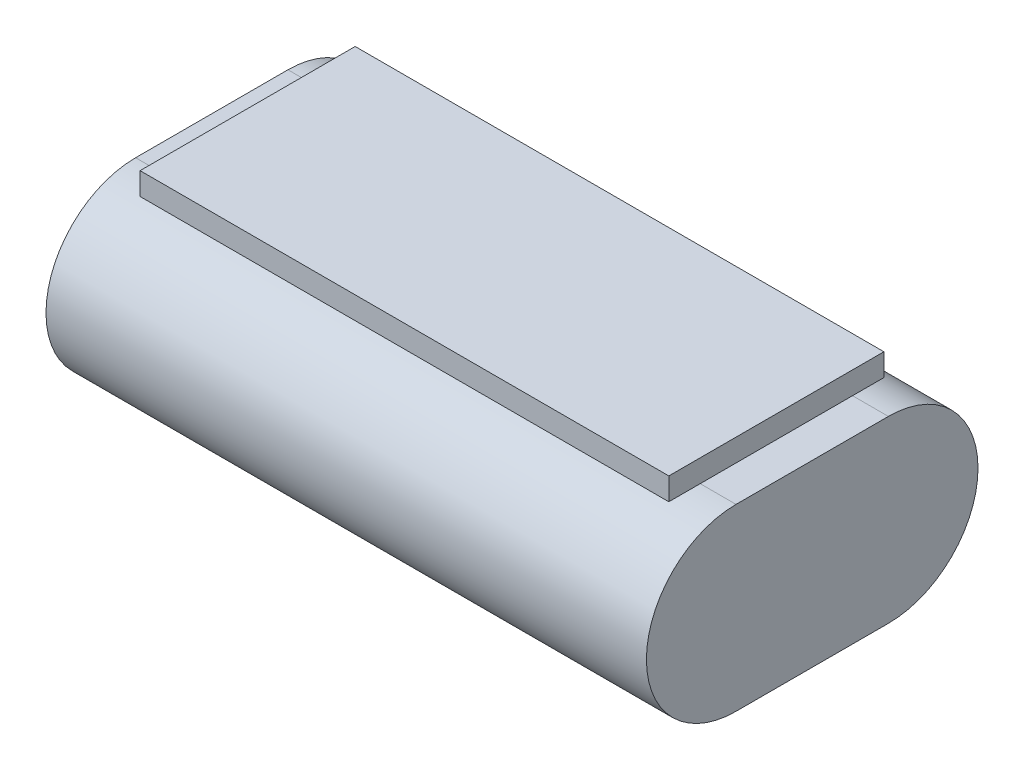
ISO-10303-21;
HEADER;
FILE_DESCRIPTION(('STEP AP214'),'2;1');
FILE_NAME('part.step','',(''),(''),'','','');
FILE_SCHEMA(('AUTOMOTIVE_DESIGN { 1 0 10303 214 1 1 1 1 }'));
ENDSEC;
DATA;
#1=APPLICATION_CONTEXT('core data for automotive mechanical design processes');
#2=APPLICATION_PROTOCOL_DEFINITION('international standard','automotive_design',2000,#1);
#3=PRODUCT_CONTEXT('',#1,'mechanical');
#4=PRODUCT('Part','Part','',(#3));
#5=PRODUCT_RELATED_PRODUCT_CATEGORY('part','',(#4));
#6=PRODUCT_DEFINITION_FORMATION('','',#4);
#7=PRODUCT_DEFINITION_CONTEXT('part definition',#1,'design');
#8=PRODUCT_DEFINITION('design','',#6,#7);
#9=PRODUCT_DEFINITION_SHAPE('','',#8);
#10=(LENGTH_UNIT() NAMED_UNIT(*) SI_UNIT(.MILLI.,.METRE.));
#11=(NAMED_UNIT(*) PLANE_ANGLE_UNIT() SI_UNIT($,.RADIAN.));
#12=(NAMED_UNIT(*) SI_UNIT($,.STERADIAN.) SOLID_ANGLE_UNIT());
#13=UNCERTAINTY_MEASURE_WITH_UNIT(LENGTH_MEASURE(1.E-05),#10,'distance_accuracy_value','');
#14=(GEOMETRIC_REPRESENTATION_CONTEXT(3) GLOBAL_UNCERTAINTY_ASSIGNED_CONTEXT((#13)) GLOBAL_UNIT_ASSIGNED_CONTEXT((#10,
#11,#12)) REPRESENTATION_CONTEXT('',''));
#15=CARTESIAN_POINT('',(0.,0.,0.));
#16=DIRECTION('',(0.,0.,1.));
#17=DIRECTION('',(1.,0.,0.));
#18=AXIS2_PLACEMENT_3D('',#15,#16,#17);
#19=CARTESIAN_POINT('',(33.5,10.,8.5));
#20=DIRECTION('',(0.,-1.,0.));
#21=DIRECTION('',(0.,0.,-1.));
#22=AXIS2_PLACEMENT_3D('',#19,#20,#21);
#23=PLANE('',#22);
#24=DIRECTION('',(0.,0.,-1.));
#25=VECTOR('',#24,1.);
#26=CARTESIAN_POINT('',(29.5,10.,8.5));
#27=LINE('',#26,#25);
#28=CARTESIAN_POINT('',(29.5,10.,8.5));
#29=VERTEX_POINT('',#28);
#30=CARTESIAN_POINT('',(29.5,10.,-8.5));
#31=VERTEX_POINT('',#30);
#32=EDGE_CURVE('E11',#29,#31,#27,.T.);
#33=ORIENTED_EDGE('',*,*,#32,.F.);
#34=DIRECTION('',(-1.,0.,0.));
#35=VECTOR('',#34,1.);
#36=CARTESIAN_POINT('',(33.5,10.,8.5));
#37=LINE('',#36,#35);
#38=CARTESIAN_POINT('',(33.5,10.,8.5));
#39=VERTEX_POINT('',#38);
#40=EDGE_CURVE('E165',#39,#29,#37,.T.);
#41=ORIENTED_EDGE('',*,*,#40,.F.);
#42=DIRECTION('',(0.,0.,1.));
#43=VECTOR('',#42,1.);
#44=CARTESIAN_POINT('',(33.5,10.,8.5));
#45=LINE('',#44,#43);
#46=CARTESIAN_POINT('',(33.5,10.,-8.5));
#47=VERTEX_POINT('',#46);
#48=EDGE_CURVE('E156',#47,#39,#45,.T.);
#49=ORIENTED_EDGE('',*,*,#48,.F.);
#50=DIRECTION('',(-1.,0.,0.));
#51=VECTOR('',#50,1.);
#52=CARTESIAN_POINT('',(33.5,10.,-8.5));
#53=LINE('',#52,#51);
#54=EDGE_CURVE('E170',#47,#31,#53,.T.);
#55=ORIENTED_EDGE('',*,*,#54,.T.);
#56=EDGE_LOOP('',(#33,#41,#49,#55));
#57=FACE_BOUND('',#56,.T.);
#58=ADVANCED_FACE('F35',(#57),#23,.F.);
#59=DIRECTION('',(0.,0.,1.));
#60=VECTOR('',#59,1.);
#61=CARTESIAN_POINT('',(-29.5,10.,8.5));
#62=LINE('',#61,#60);
#63=CARTESIAN_POINT('',(-29.5,10.,-8.5));
#64=VERTEX_POINT('',#63);
#65=CARTESIAN_POINT('',(-29.5,10.,8.5));
#66=VERTEX_POINT('',#65);
#67=EDGE_CURVE('E43',#64,#66,#62,.T.);
#68=ORIENTED_EDGE('',*,*,#67,.F.);
#69=CARTESIAN_POINT('',(-33.5,10.,-8.5));
#70=VERTEX_POINT('',#69);
#71=EDGE_CURVE('E168',#64,#70,#53,.T.);
#72=ORIENTED_EDGE('',*,*,#71,.T.);
#73=DIRECTION('',(0.,0.,1.));
#74=VECTOR('',#73,1.);
#75=CARTESIAN_POINT('',(-33.5,10.,8.5));
#76=LINE('',#75,#74);
#77=CARTESIAN_POINT('',(-33.5,10.,8.5));
#78=VERTEX_POINT('',#77);
#79=EDGE_CURVE('E152',#70,#78,#76,.T.);
#80=ORIENTED_EDGE('',*,*,#79,.T.);
#81=EDGE_CURVE('E157',#66,#78,#37,.T.);
#82=ORIENTED_EDGE('',*,*,#81,.F.);
#83=EDGE_LOOP('',(#68,#72,#80,#82));
#84=FACE_BOUND('',#83,.T.);
#85=ADVANCED_FACE('F230',(#84),#23,.F.);
#86=CARTESIAN_POINT('',(33.5,0.,8.5));
#87=DIRECTION('',(-1.,0.,0.));
#88=DIRECTION('',(0.,0.,1.));
#89=AXIS2_PLACEMENT_3D('',#86,#87,#88);
#90=CYLINDRICAL_SURFACE('',#89,10.);
#91=CARTESIAN_POINT('',(-33.5,0.,8.5));
#92=DIRECTION('',(1.,0.,0.));
#93=DIRECTION('',(0.,0.,-1.));
#94=AXIS2_PLACEMENT_3D('',#91,#92,#93);
#95=CIRCLE('',#94,10.);
#96=CARTESIAN_POINT('',(-33.5,-10.,8.5));
#97=VERTEX_POINT('',#96);
#98=EDGE_CURVE('E139',#78,#97,#95,.T.);
#99=ORIENTED_EDGE('',*,*,#98,.T.);
#100=DIRECTION('',(-1.,0.,0.));
#101=VECTOR('',#100,1.);
#102=CARTESIAN_POINT('',(33.5,-10.,8.5));
#103=LINE('',#102,#101);
#104=CARTESIAN_POINT('',(33.5,-10.,8.5));
#105=VERTEX_POINT('',#104);
#106=EDGE_CURVE('E175',#105,#97,#103,.T.);
#107=ORIENTED_EDGE('',*,*,#106,.F.);
#108=CARTESIAN_POINT('',(33.5,0.,8.5));
#109=DIRECTION('',(1.,0.,0.));
#110=DIRECTION('',(0.,0.,-1.));
#111=AXIS2_PLACEMENT_3D('',#108,#109,#110);
#112=CIRCLE('',#111,10.);
#113=EDGE_CURVE('E148',#39,#105,#112,.T.);
#114=ORIENTED_EDGE('',*,*,#113,.F.);
#115=ORIENTED_EDGE('',*,*,#40,.T.);
#116=EDGE_CURVE('E169',#29,#66,#37,.T.);
#117=ORIENTED_EDGE('',*,*,#116,.T.);
#118=ORIENTED_EDGE('',*,*,#81,.T.);
#119=EDGE_LOOP('',(#99,#107,#114,#115,#117,#118));
#120=FACE_BOUND('',#119,.T.);
#121=ADVANCED_FACE('F37',(#120),#90,.T.);
#122=CARTESIAN_POINT('',(33.5,-10.,8.5));
#123=DIRECTION('',(0.,1.,0.));
#124=DIRECTION('',(0.,0.,1.));
#125=AXIS2_PLACEMENT_3D('',#122,#123,#124);
#126=PLANE('',#125);
#127=DIRECTION('',(0.,0.,-1.));
#128=VECTOR('',#127,1.);
#129=CARTESIAN_POINT('',(-33.5,-10.,8.5));
#130=LINE('',#129,#128);
#131=CARTESIAN_POINT('',(-33.5,-10.,-8.49999999999999));
#132=VERTEX_POINT('',#131);
#133=EDGE_CURVE('E142',#97,#132,#130,.T.);
#134=ORIENTED_EDGE('',*,*,#133,.T.);
#135=DIRECTION('',(-1.,0.,0.));
#136=VECTOR('',#135,1.);
#137=CARTESIAN_POINT('',(33.5,-10.,-8.49999999999999));
#138=LINE('',#137,#136);
#139=CARTESIAN_POINT('',(33.5,-10.,-8.49999999999999));
#140=VERTEX_POINT('',#139);
#141=EDGE_CURVE('E172',#140,#132,#138,.T.);
#142=ORIENTED_EDGE('',*,*,#141,.F.);
#143=DIRECTION('',(0.,0.,-1.));
#144=VECTOR('',#143,1.);
#145=CARTESIAN_POINT('',(33.5,-10.,8.5));
#146=LINE('',#145,#144);
#147=EDGE_CURVE('E151',#105,#140,#146,.T.);
#148=ORIENTED_EDGE('',*,*,#147,.F.);
#149=ORIENTED_EDGE('',*,*,#106,.T.);
#150=EDGE_LOOP('',(#134,#142,#148,#149));
#151=FACE_BOUND('',#150,.T.);
#152=ADVANCED_FACE('F219',(#151),#126,.F.);
#153=CARTESIAN_POINT('',(33.5,0.,-8.5));
#154=DIRECTION('',(-1.,0.,0.));
#155=DIRECTION('',(0.,0.,1.));
#156=AXIS2_PLACEMENT_3D('',#153,#154,#155);
#157=CYLINDRICAL_SURFACE('',#156,10.);
#158=CARTESIAN_POINT('',(-33.5,0.,-8.5));
#159=DIRECTION('',(1.,0.,0.));
#160=DIRECTION('',(0.,0.,-1.));
#161=AXIS2_PLACEMENT_3D('',#158,#159,#160);
#162=CIRCLE('',#161,10.);
#163=EDGE_CURVE('E160',#132,#70,#162,.T.);
#164=ORIENTED_EDGE('',*,*,#163,.T.);
#165=ORIENTED_EDGE('',*,*,#71,.F.);
#166=EDGE_CURVE('E56',#31,#64,#53,.T.);
#167=ORIENTED_EDGE('',*,*,#166,.F.);
#168=ORIENTED_EDGE('',*,*,#54,.F.);
#169=CARTESIAN_POINT('',(33.5,0.,-8.5));
#170=DIRECTION('',(1.,0.,0.));
#171=DIRECTION('',(0.,0.,-1.));
#172=AXIS2_PLACEMENT_3D('',#169,#170,#171);
#173=CIRCLE('',#172,10.);
#174=EDGE_CURVE('E154',#140,#47,#173,.T.);
#175=ORIENTED_EDGE('',*,*,#174,.F.);
#176=ORIENTED_EDGE('',*,*,#141,.T.);
#177=EDGE_LOOP('',(#164,#165,#167,#168,#175,#176));
#178=FACE_BOUND('',#177,.T.);
#179=ADVANCED_FACE('F215',(#178),#157,.T.);
#180=CARTESIAN_POINT('',(33.5,0.,8.5));
#181=DIRECTION('',(1.,0.,0.));
#182=DIRECTION('',(0.,0.,-1.));
#183=AXIS2_PLACEMENT_3D('',#180,#181,#182);
#184=PLANE('',#183);
#185=ORIENTED_EDGE('',*,*,#113,.T.);
#186=ORIENTED_EDGE('',*,*,#147,.T.);
#187=ORIENTED_EDGE('',*,*,#174,.T.);
#188=ORIENTED_EDGE('',*,*,#48,.T.);
#189=EDGE_LOOP('',(#185,#186,#187,#188));
#190=FACE_BOUND('',#189,.T.);
#191=ADVANCED_FACE('F212',(#190),#184,.T.);
#192=CARTESIAN_POINT('',(-33.5,0.,8.5));
#193=DIRECTION('',(1.,0.,0.));
#194=DIRECTION('',(0.,0.,-1.));
#195=AXIS2_PLACEMENT_3D('',#192,#193,#194);
#196=PLANE('',#195);
#197=ORIENTED_EDGE('',*,*,#98,.F.);
#198=ORIENTED_EDGE('',*,*,#79,.F.);
#199=ORIENTED_EDGE('',*,*,#163,.F.);
#200=ORIENTED_EDGE('',*,*,#133,.F.);
#201=EDGE_LOOP('',(#197,#198,#199,#200));
#202=FACE_BOUND('',#201,.T.);
#203=ADVANCED_FACE('F225',(#202),#196,.F.);
#204=CARTESIAN_POINT('',(0.,10.,0.));
#205=DIRECTION('',(0.,-1.,0.));
#206=DIRECTION('',(0.,0.,-1.));
#207=AXIS2_PLACEMENT_3D('',#204,#205,#206);
#208=PLANE('',#207);
#209=ORIENTED_EDGE('',*,*,#116,.F.);
#210=DIRECTION('',(0.,0.,-1.));
#211=VECTOR('',#210,1.);
#212=CARTESIAN_POINT('',(29.5,10.,12.));
#213=LINE('',#212,#211);
#214=CARTESIAN_POINT('',(29.5,10.,12.));
#215=VERTEX_POINT('',#214);
#216=EDGE_CURVE('E201',#215,#29,#213,.T.);
#217=ORIENTED_EDGE('',*,*,#216,.F.);
#218=DIRECTION('',(1.,0.,0.));
#219=VECTOR('',#218,1.);
#220=CARTESIAN_POINT('',(-29.5,10.,12.));
#221=LINE('',#220,#219);
#222=CARTESIAN_POINT('',(-29.5,10.,12.));
#223=VERTEX_POINT('',#222);
#224=EDGE_CURVE('E132',#223,#215,#221,.T.);
#225=ORIENTED_EDGE('',*,*,#224,.F.);
#226=DIRECTION('',(0.,0.,1.));
#227=VECTOR('',#226,1.);
#228=CARTESIAN_POINT('',(-29.5,10.,12.));
#229=LINE('',#228,#227);
#230=EDGE_CURVE('E182',#66,#223,#229,.T.);
#231=ORIENTED_EDGE('',*,*,#230,.F.);
#232=EDGE_LOOP('',(#209,#217,#225,#231));
#233=FACE_BOUND('',#232,.T.);
#234=ADVANCED_FACE('F200',(#233),#208,.T.);
#235=CARTESIAN_POINT('',(29.5,12.5,12.));
#236=DIRECTION('',(-1.,0.,0.));
#237=DIRECTION('',(0.,0.,1.));
#238=AXIS2_PLACEMENT_3D('',#235,#236,#237);
#239=PLANE('',#238);
#240=ORIENTED_EDGE('',*,*,#216,.T.);
#241=ORIENTED_EDGE('',*,*,#32,.T.);
#242=CARTESIAN_POINT('',(29.5,10.,-12.));
#243=VERTEX_POINT('',#242);
#244=EDGE_CURVE('E137',#31,#243,#213,.T.);
#245=ORIENTED_EDGE('',*,*,#244,.T.);
#246=DIRECTION('',(0.,-1.,0.));
#247=VECTOR('',#246,1.);
#248=CARTESIAN_POINT('',(29.5,12.5,-12.));
#249=LINE('',#248,#247);
#250=CARTESIAN_POINT('',(29.5,12.5,-12.));
#251=VERTEX_POINT('',#250);
#252=EDGE_CURVE('E117',#251,#243,#249,.T.);
#253=ORIENTED_EDGE('',*,*,#252,.F.);
#254=DIRECTION('',(0.,0.,-1.));
#255=VECTOR('',#254,1.);
#256=CARTESIAN_POINT('',(29.5,12.5,12.));
#257=LINE('',#256,#255);
#258=CARTESIAN_POINT('',(29.5,12.5,12.));
#259=VERTEX_POINT('',#258);
#260=EDGE_CURVE('E123',#259,#251,#257,.T.);
#261=ORIENTED_EDGE('',*,*,#260,.F.);
#262=DIRECTION('',(0.,-1.,0.));
#263=VECTOR('',#262,1.);
#264=CARTESIAN_POINT('',(29.5,12.5,12.));
#265=LINE('',#264,#263);
#266=EDGE_CURVE('E193',#259,#215,#265,.T.);
#267=ORIENTED_EDGE('',*,*,#266,.T.);
#268=EDGE_LOOP('',(#240,#241,#245,#253,#261,#267));
#269=FACE_BOUND('',#268,.T.);
#270=ADVANCED_FACE('F135',(#269),#239,.F.);
#271=CARTESIAN_POINT('',(-29.5,12.5,-12.));
#272=DIRECTION('',(0.,0.,1.));
#273=DIRECTION('',(1.,0.,0.));
#274=AXIS2_PLACEMENT_3D('',#271,#272,#273);
#275=PLANE('',#274);
#276=DIRECTION('',(-1.,0.,0.));
#277=VECTOR('',#276,1.);
#278=CARTESIAN_POINT('',(-29.5,10.,-12.));
#279=LINE('',#278,#277);
#280=CARTESIAN_POINT('',(-29.5,10.,-12.));
#281=VERTEX_POINT('',#280);
#282=EDGE_CURVE('E189',#243,#281,#279,.T.);
#283=ORIENTED_EDGE('',*,*,#282,.T.);
#284=DIRECTION('',(0.,-1.,0.));
#285=VECTOR('',#284,1.);
#286=CARTESIAN_POINT('',(-29.5,12.5,-12.));
#287=LINE('',#286,#285);
#288=CARTESIAN_POINT('',(-29.5,12.5,-12.));
#289=VERTEX_POINT('',#288);
#290=EDGE_CURVE('E119',#289,#281,#287,.T.);
#291=ORIENTED_EDGE('',*,*,#290,.F.);
#292=DIRECTION('',(-1.,0.,0.));
#293=VECTOR('',#292,1.);
#294=CARTESIAN_POINT('',(-29.5,12.5,-12.));
#295=LINE('',#294,#293);
#296=EDGE_CURVE('E113',#251,#289,#295,.T.);
#297=ORIENTED_EDGE('',*,*,#296,.F.);
#298=ORIENTED_EDGE('',*,*,#252,.T.);
#299=EDGE_LOOP('',(#283,#291,#297,#298));
#300=FACE_BOUND('',#299,.T.);
#301=ADVANCED_FACE('F115',(#300),#275,.F.);
#302=CARTESIAN_POINT('',(-29.5,12.5,12.));
#303=DIRECTION('',(1.,0.,0.));
#304=DIRECTION('',(0.,0.,-1.));
#305=AXIS2_PLACEMENT_3D('',#302,#303,#304);
#306=PLANE('',#305);
#307=EDGE_CURVE('E185',#281,#64,#229,.T.);
#308=ORIENTED_EDGE('',*,*,#307,.T.);
#309=ORIENTED_EDGE('',*,*,#67,.T.);
#310=ORIENTED_EDGE('',*,*,#230,.T.);
#311=DIRECTION('',(0.,-1.,0.));
#312=VECTOR('',#311,1.);
#313=CARTESIAN_POINT('',(-29.5,12.5,12.));
#314=LINE('',#313,#312);
#315=CARTESIAN_POINT('',(-29.5,12.5,12.));
#316=VERTEX_POINT('',#315);
#317=EDGE_CURVE('E144',#316,#223,#314,.T.);
#318=ORIENTED_EDGE('',*,*,#317,.F.);
#319=DIRECTION('',(0.,0.,1.));
#320=VECTOR('',#319,1.);
#321=CARTESIAN_POINT('',(-29.5,12.5,12.));
#322=LINE('',#321,#320);
#323=EDGE_CURVE('E122',#289,#316,#322,.T.);
#324=ORIENTED_EDGE('',*,*,#323,.F.);
#325=ORIENTED_EDGE('',*,*,#290,.T.);
#326=EDGE_LOOP('',(#308,#309,#310,#318,#324,#325));
#327=FACE_BOUND('',#326,.T.);
#328=ADVANCED_FACE('F179',(#327),#306,.F.);
#329=CARTESIAN_POINT('',(-29.5,12.5,12.));
#330=DIRECTION('',(0.,0.,-1.));
#331=DIRECTION('',(-1.,0.,0.));
#332=AXIS2_PLACEMENT_3D('',#329,#330,#331);
#333=PLANE('',#332);
#334=ORIENTED_EDGE('',*,*,#224,.T.);
#335=ORIENTED_EDGE('',*,*,#266,.F.);
#336=DIRECTION('',(1.,0.,0.));
#337=VECTOR('',#336,1.);
#338=CARTESIAN_POINT('',(-29.5,12.5,12.));
#339=LINE('',#338,#337);
#340=EDGE_CURVE('E128',#316,#259,#339,.T.);
#341=ORIENTED_EDGE('',*,*,#340,.F.);
#342=ORIENTED_EDGE('',*,*,#317,.T.);
#343=EDGE_LOOP('',(#334,#335,#341,#342));
#344=FACE_BOUND('',#343,.T.);
#345=ADVANCED_FACE('F196',(#344),#333,.F.);
#346=CARTESIAN_POINT('',(0.,12.5,0.));
#347=DIRECTION('',(0.,-1.,0.));
#348=DIRECTION('',(0.,0.,-1.));
#349=AXIS2_PLACEMENT_3D('',#346,#347,#348);
#350=PLANE('',#349);
#351=ORIENTED_EDGE('',*,*,#260,.T.);
#352=ORIENTED_EDGE('',*,*,#296,.T.);
#353=ORIENTED_EDGE('',*,*,#323,.T.);
#354=ORIENTED_EDGE('',*,*,#340,.T.);
#355=EDGE_LOOP('',(#351,#352,#353,#354));
#356=FACE_BOUND('',#355,.T.);
#357=ADVANCED_FACE('F126',(#356),#350,.F.);
#358=ORIENTED_EDGE('',*,*,#244,.F.);
#359=ORIENTED_EDGE('',*,*,#166,.T.);
#360=ORIENTED_EDGE('',*,*,#307,.F.);
#361=ORIENTED_EDGE('',*,*,#282,.F.);
#362=EDGE_LOOP('',(#358,#359,#360,#361));
#363=FACE_BOUND('',#362,.T.);
#364=ADVANCED_FACE('F204',(#363),#208,.T.);
#365=CLOSED_SHELL('',(#58,#85,#121,#152,#179,#191,#203,#234,#270,#301,#328,#345,#357,#364));
#366=MANIFOLD_SOLID_BREP('B2',#365);
#367=ADVANCED_BREP_SHAPE_REPRESENTATION('',(#18,#366),#14);
#368=SHAPE_DEFINITION_REPRESENTATION(#9,#367);
ENDSEC;
END-ISO-10303-21;
